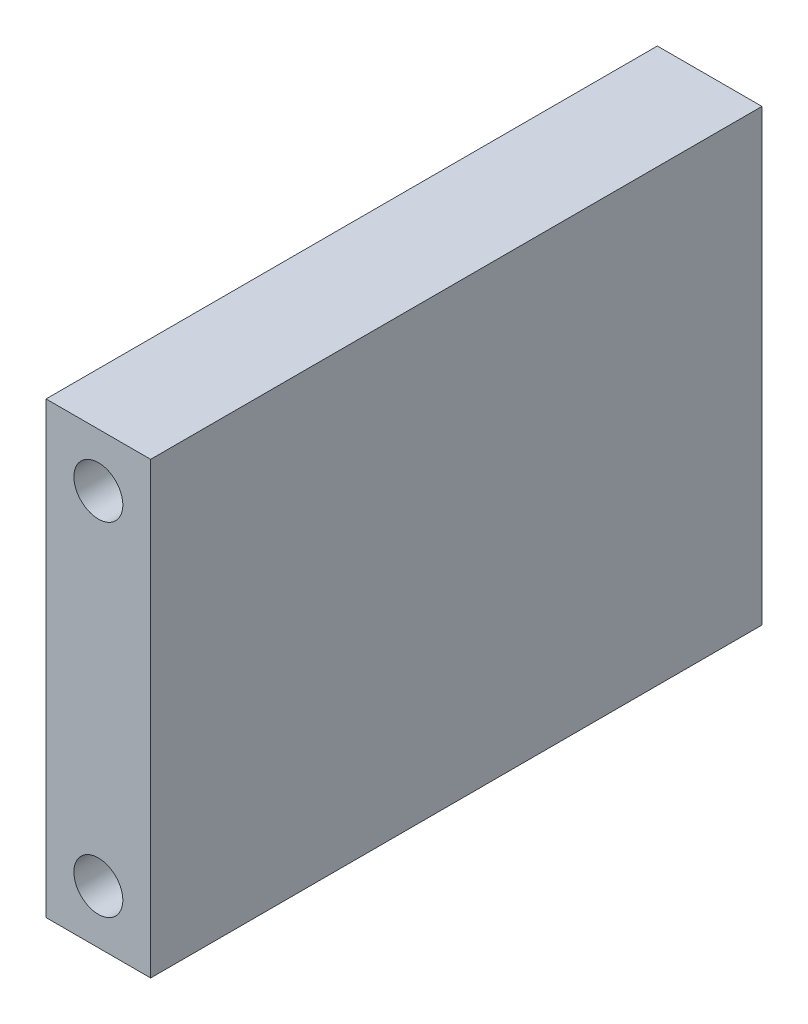
ISO-10303-21;
HEADER;
FILE_DESCRIPTION(('STEP AP214'),'2;1');
FILE_NAME('part.step','',(''),(''),'','','');
FILE_SCHEMA(('AUTOMOTIVE_DESIGN { 1 0 10303 214 1 1 1 1 }'));
ENDSEC;
DATA;
#1=APPLICATION_CONTEXT('core data for automotive mechanical design processes');
#2=APPLICATION_PROTOCOL_DEFINITION('international standard','automotive_design',2000,#1);
#3=PRODUCT_CONTEXT('',#1,'mechanical');
#4=PRODUCT('Part','Part','',(#3));
#5=PRODUCT_RELATED_PRODUCT_CATEGORY('part','',(#4));
#6=PRODUCT_DEFINITION_FORMATION('','',#4);
#7=PRODUCT_DEFINITION_CONTEXT('part definition',#1,'design');
#8=PRODUCT_DEFINITION('design','',#6,#7);
#9=PRODUCT_DEFINITION_SHAPE('','',#8);
#10=(LENGTH_UNIT() NAMED_UNIT(*) SI_UNIT(.MILLI.,.METRE.));
#11=(NAMED_UNIT(*) PLANE_ANGLE_UNIT() SI_UNIT($,.RADIAN.));
#12=(NAMED_UNIT(*) SI_UNIT($,.STERADIAN.) SOLID_ANGLE_UNIT());
#13=UNCERTAINTY_MEASURE_WITH_UNIT(LENGTH_MEASURE(1.E-05),#10,'distance_accuracy_value','');
#14=(GEOMETRIC_REPRESENTATION_CONTEXT(3) GLOBAL_UNCERTAINTY_ASSIGNED_CONTEXT((#13)) GLOBAL_UNIT_ASSIGNED_CONTEXT((#10,
#11,#12)) REPRESENTATION_CONTEXT('',''));
#15=CARTESIAN_POINT('',(0.,0.,0.));
#16=DIRECTION('',(0.,0.,1.));
#17=DIRECTION('',(1.,0.,0.));
#18=AXIS2_PLACEMENT_3D('',#15,#16,#17);
#19=CARTESIAN_POINT('',(0.,0.,100.));
#20=DIRECTION('',(0.,0.,1.));
#21=DIRECTION('',(1.,0.,0.));
#22=AXIS2_PLACEMENT_3D('',#19,#20,#21);
#23=PLANE('',#22);
#24=CARTESIAN_POINT('',(-0.335867215103036,-27.5104308390023,100.));
#25=DIRECTION('',(0.,0.,1.));
#26=DIRECTION('',(1.,0.,0.));
#27=AXIS2_PLACEMENT_3D('',#24,#25,#26);
#28=CIRCLE('',#27,4.);
#29=CARTESIAN_POINT('',(-4.33586721510304,-27.5104308390023,100.));
#30=VERTEX_POINT('',#29);
#31=EDGE_CURVE('E116',#30,#30,#28,.T.);
#32=ORIENTED_EDGE('',*,*,#31,.F.);
#33=EDGE_LOOP('',(#32));
#34=FACE_BOUND('',#33,.T.);
#35=DIRECTION('',(1.,0.,0.));
#36=VECTOR('',#35,1.);
#37=CARTESIAN_POINT('',(-8.89128955954653,-36.252349526689,100.));
#38=LINE('',#37,#36);
#39=CARTESIAN_POINT('',(-8.89128955954653,-36.252349526689,100.));
#40=VERTEX_POINT('',#39);
#41=CARTESIAN_POINT('',(8.21955512934046,-36.252349526689,100.));
#42=VERTEX_POINT('',#41);
#43=EDGE_CURVE('E96',#40,#42,#38,.T.);
#44=ORIENTED_EDGE('',*,*,#43,.T.);
#45=DIRECTION('',(0.,1.,0.));
#46=VECTOR('',#45,1.);
#47=CARTESIAN_POINT('',(8.21955512934046,-36.252349526689,100.));
#48=LINE('',#47,#46);
#49=CARTESIAN_POINT('',(8.21955512934046,37.2314878486845,100.));
#50=VERTEX_POINT('',#49);
#51=EDGE_CURVE('E91',#42,#50,#48,.T.);
#52=ORIENTED_EDGE('',*,*,#51,.T.);
#53=DIRECTION('',(-1.,0.,0.));
#54=VECTOR('',#53,1.);
#55=CARTESIAN_POINT('',(8.21955512934046,37.2314878486845,100.));
#56=LINE('',#55,#54);
#57=CARTESIAN_POINT('',(-8.89128955954653,37.2314878486845,100.));
#58=VERTEX_POINT('',#57);
#59=EDGE_CURVE('E94',#50,#58,#56,.T.);
#60=ORIENTED_EDGE('',*,*,#59,.T.);
#61=DIRECTION('',(0.,-1.,0.));
#62=VECTOR('',#61,1.);
#63=CARTESIAN_POINT('',(-8.89128955954653,37.2314878486845,100.));
#64=LINE('',#63,#62);
#65=EDGE_CURVE('E61',#58,#40,#64,.T.);
#66=ORIENTED_EDGE('',*,*,#65,.T.);
#67=EDGE_LOOP('',(#44,#52,#60,#66));
#68=FACE_BOUND('',#67,.T.);
#69=CARTESIAN_POINT('',(-0.335867215103036,28.4895691609977,100.));
#70=DIRECTION('',(0.,0.,1.));
#71=DIRECTION('',(1.,0.,0.));
#72=AXIS2_PLACEMENT_3D('',#69,#70,#71);
#73=CIRCLE('',#72,4.);
#74=CARTESIAN_POINT('',(-4.33586721510304,28.4895691609977,100.));
#75=VERTEX_POINT('',#74);
#76=EDGE_CURVE('E138',#75,#75,#73,.T.);
#77=ORIENTED_EDGE('',*,*,#76,.F.);
#78=EDGE_LOOP('',(#77));
#79=FACE_BOUND('',#78,.T.);
#80=ADVANCED_FACE('F43',(#34,#68,#79),#23,.T.);
#81=CARTESIAN_POINT('',(0.,0.,0.));
#82=DIRECTION('',(0.,0.,1.));
#83=DIRECTION('',(1.,0.,0.));
#84=AXIS2_PLACEMENT_3D('',#81,#82,#83);
#85=PLANE('',#84);
#86=DIRECTION('',(1.,0.,0.));
#87=VECTOR('',#86,1.);
#88=CARTESIAN_POINT('',(-8.89128955954653,-36.252349526689,0.));
#89=LINE('',#88,#87);
#90=CARTESIAN_POINT('',(-8.89128955954653,-36.252349526689,0.));
#91=VERTEX_POINT('',#90);
#92=CARTESIAN_POINT('',(8.21955512934046,-36.252349526689,0.));
#93=VERTEX_POINT('',#92);
#94=EDGE_CURVE('E112',#91,#93,#89,.T.);
#95=ORIENTED_EDGE('',*,*,#94,.F.);
#96=DIRECTION('',(0.,-1.,0.));
#97=VECTOR('',#96,1.);
#98=CARTESIAN_POINT('',(-8.89128955954653,37.2314878486845,0.));
#99=LINE('',#98,#97);
#100=CARTESIAN_POINT('',(-8.89128955954653,37.2314878486845,0.));
#101=VERTEX_POINT('',#100);
#102=EDGE_CURVE('E84',#101,#91,#99,.T.);
#103=ORIENTED_EDGE('',*,*,#102,.F.);
#104=DIRECTION('',(-1.,0.,0.));
#105=VECTOR('',#104,1.);
#106=CARTESIAN_POINT('',(8.21955512934046,37.2314878486845,0.));
#107=LINE('',#106,#105);
#108=CARTESIAN_POINT('',(8.21955512934046,37.2314878486845,0.));
#109=VERTEX_POINT('',#108);
#110=EDGE_CURVE('E78',#109,#101,#107,.T.);
#111=ORIENTED_EDGE('',*,*,#110,.F.);
#112=DIRECTION('',(0.,1.,0.));
#113=VECTOR('',#112,1.);
#114=CARTESIAN_POINT('',(8.21955512934046,-36.252349526689,0.));
#115=LINE('',#114,#113);
#116=EDGE_CURVE('E101',#93,#109,#115,.T.);
#117=ORIENTED_EDGE('',*,*,#116,.F.);
#118=EDGE_LOOP('',(#95,#103,#111,#117));
#119=FACE_BOUND('',#118,.T.);
#120=CARTESIAN_POINT('',(-0.335867215103036,-27.5104308390023,0.));
#121=DIRECTION('',(0.,0.,1.));
#122=DIRECTION('',(1.,0.,0.));
#123=AXIS2_PLACEMENT_3D('',#120,#121,#122);
#124=CIRCLE('',#123,4.);
#125=CARTESIAN_POINT('',(-4.33586721510304,-27.5104308390023,0.));
#126=VERTEX_POINT('',#125);
#127=EDGE_CURVE('E134',#126,#126,#124,.T.);
#128=ORIENTED_EDGE('',*,*,#127,.T.);
#129=EDGE_LOOP('',(#128));
#130=FACE_BOUND('',#129,.T.);
#131=CARTESIAN_POINT('',(-0.335867215103036,28.4895691609977,0.));
#132=DIRECTION('',(0.,0.,1.));
#133=DIRECTION('',(1.,0.,0.));
#134=AXIS2_PLACEMENT_3D('',#131,#132,#133);
#135=CIRCLE('',#134,4.);
#136=CARTESIAN_POINT('',(-4.33586721510304,28.4895691609977,0.));
#137=VERTEX_POINT('',#136);
#138=EDGE_CURVE('E142',#137,#137,#135,.T.);
#139=ORIENTED_EDGE('',*,*,#138,.T.);
#140=EDGE_LOOP('',(#139));
#141=FACE_BOUND('',#140,.T.);
#142=ADVANCED_FACE('F129',(#119,#130,#141),#85,.F.);
#143=CARTESIAN_POINT('',(-8.89128955954653,-36.252349526689,100.));
#144=DIRECTION('',(0.,1.,0.));
#145=DIRECTION('',(0.,0.,1.));
#146=AXIS2_PLACEMENT_3D('',#143,#144,#145);
#147=PLANE('',#146);
#148=ORIENTED_EDGE('',*,*,#94,.T.);
#149=DIRECTION('',(0.,0.,-1.));
#150=VECTOR('',#149,1.);
#151=CARTESIAN_POINT('',(8.21955512934046,-36.252349526689,100.));
#152=LINE('',#151,#150);
#153=EDGE_CURVE('E11',#42,#93,#152,.T.);
#154=ORIENTED_EDGE('',*,*,#153,.F.);
#155=ORIENTED_EDGE('',*,*,#43,.F.);
#156=DIRECTION('',(0.,0.,-1.));
#157=VECTOR('',#156,1.);
#158=CARTESIAN_POINT('',(-8.89128955954653,-36.252349526689,100.));
#159=LINE('',#158,#157);
#160=EDGE_CURVE('E108',#40,#91,#159,.T.);
#161=ORIENTED_EDGE('',*,*,#160,.T.);
#162=EDGE_LOOP('',(#148,#154,#155,#161));
#163=FACE_BOUND('',#162,.T.);
#164=ADVANCED_FACE('F45',(#163),#147,.F.);
#165=CARTESIAN_POINT('',(8.21955512934046,-36.252349526689,100.));
#166=DIRECTION('',(-1.,0.,0.));
#167=DIRECTION('',(0.,0.,1.));
#168=AXIS2_PLACEMENT_3D('',#165,#166,#167);
#169=PLANE('',#168);
#170=ORIENTED_EDGE('',*,*,#116,.T.);
#171=DIRECTION('',(0.,0.,-1.));
#172=VECTOR('',#171,1.);
#173=CARTESIAN_POINT('',(8.21955512934046,37.2314878486845,100.));
#174=LINE('',#173,#172);
#175=EDGE_CURVE('E53',#50,#109,#174,.T.);
#176=ORIENTED_EDGE('',*,*,#175,.F.);
#177=ORIENTED_EDGE('',*,*,#51,.F.);
#178=ORIENTED_EDGE('',*,*,#153,.T.);
#179=EDGE_LOOP('',(#170,#176,#177,#178));
#180=FACE_BOUND('',#179,.T.);
#181=ADVANCED_FACE('F100',(#180),#169,.F.);
#182=CARTESIAN_POINT('',(8.21955512934046,37.2314878486845,100.));
#183=DIRECTION('',(0.,-1.,0.));
#184=DIRECTION('',(0.,0.,-1.));
#185=AXIS2_PLACEMENT_3D('',#182,#183,#184);
#186=PLANE('',#185);
#187=ORIENTED_EDGE('',*,*,#110,.T.);
#188=DIRECTION('',(0.,0.,-1.));
#189=VECTOR('',#188,1.);
#190=CARTESIAN_POINT('',(-8.89128955954653,37.2314878486845,100.));
#191=LINE('',#190,#189);
#192=EDGE_CURVE('E103',#58,#101,#191,.T.);
#193=ORIENTED_EDGE('',*,*,#192,.F.);
#194=ORIENTED_EDGE('',*,*,#59,.F.);
#195=ORIENTED_EDGE('',*,*,#175,.T.);
#196=EDGE_LOOP('',(#187,#193,#194,#195));
#197=FACE_BOUND('',#196,.T.);
#198=ADVANCED_FACE('F104',(#197),#186,.F.);
#199=CARTESIAN_POINT('',(-8.89128955954653,37.2314878486845,100.));
#200=DIRECTION('',(1.,0.,0.));
#201=DIRECTION('',(0.,0.,-1.));
#202=AXIS2_PLACEMENT_3D('',#199,#200,#201);
#203=PLANE('',#202);
#204=ORIENTED_EDGE('',*,*,#102,.T.);
#205=ORIENTED_EDGE('',*,*,#160,.F.);
#206=ORIENTED_EDGE('',*,*,#65,.F.);
#207=ORIENTED_EDGE('',*,*,#192,.T.);
#208=EDGE_LOOP('',(#204,#205,#206,#207));
#209=FACE_BOUND('',#208,.T.);
#210=ADVANCED_FACE('F126',(#209),#203,.F.);
#211=CARTESIAN_POINT('',(-0.335867215103036,-27.5104308390023,100.));
#212=DIRECTION('',(0.,0.,-1.));
#213=DIRECTION('',(-1.,0.,0.));
#214=AXIS2_PLACEMENT_3D('',#211,#212,#213);
#215=CYLINDRICAL_SURFACE('',#214,4.);
#216=CARTESIAN_POINT('',(-4.33586721510304,-27.5104308390023,100.));
#217=CARTESIAN_POINT('',(-4.33586721510304,-27.5104308390023,98.9583333333333));
#218=CARTESIAN_POINT('',(-4.33586721510304,-27.5104308390023,97.9166666666667));
#219=CARTESIAN_POINT('',(-4.33586721510304,-27.5104308390023,95.8333333333333));
#220=CARTESIAN_POINT('',(-4.33586721510304,-27.5104308390023,94.7916666666666));
#221=CARTESIAN_POINT('',(-4.33586721510304,-27.5104308390023,92.7083333333333));
#222=CARTESIAN_POINT('',(-4.33586721510304,-27.5104308390023,91.6666666666666));
#223=CARTESIAN_POINT('',(-4.33586721510304,-27.5104308390023,89.5833333333333));
#224=CARTESIAN_POINT('',(-4.33586721510304,-27.5104308390023,88.5416666666666));
#225=CARTESIAN_POINT('',(-4.33586721510304,-27.5104308390023,86.4583333333333));
#226=CARTESIAN_POINT('',(-4.33586721510304,-27.5104308390023,85.4166666666667));
#227=CARTESIAN_POINT('',(-4.33586721510304,-27.5104308390023,83.3333333333333));
#228=CARTESIAN_POINT('',(-4.33586721510304,-27.5104308390023,82.2916666666667));
#229=CARTESIAN_POINT('',(-4.33586721510304,-27.5104308390023,80.2083333333333));
#230=CARTESIAN_POINT('',(-4.33586721510304,-27.5104308390023,79.1666666666666));
#231=CARTESIAN_POINT('',(-4.33586721510304,-27.5104308390023,77.0833333333333));
#232=CARTESIAN_POINT('',(-4.33586721510304,-27.5104308390023,76.0416666666666));
#233=CARTESIAN_POINT('',(-4.33586721510304,-27.5104308390023,73.9583333333333));
#234=CARTESIAN_POINT('',(-4.33586721510304,-27.5104308390023,72.9166666666667));
#235=CARTESIAN_POINT('',(-4.33586721510304,-27.5104308390023,70.8333333333333));
#236=CARTESIAN_POINT('',(-4.33586721510304,-27.5104308390023,69.7916666666667));
#237=CARTESIAN_POINT('',(-4.33586721510304,-27.5104308390023,67.7083333333333));
#238=CARTESIAN_POINT('',(-4.33586721510304,-27.5104308390023,66.6666666666667));
#239=CARTESIAN_POINT('',(-4.33586721510304,-27.5104308390023,64.5833333333333));
#240=CARTESIAN_POINT('',(-4.33586721510304,-27.5104308390023,63.5416666666667));
#241=CARTESIAN_POINT('',(-4.33586721510304,-27.5104308390023,61.4583333333333));
#242=CARTESIAN_POINT('',(-4.33586721510304,-27.5104308390023,60.4166666666667));
#243=CARTESIAN_POINT('',(-4.33586721510304,-27.5104308390023,58.3333333333333));
#244=CARTESIAN_POINT('',(-4.33586721510304,-27.5104308390023,57.2916666666667));
#245=CARTESIAN_POINT('',(-4.33586721510304,-27.5104308390023,55.2083333333333));
#246=CARTESIAN_POINT('',(-4.33586721510304,-27.5104308390023,54.1666666666667));
#247=CARTESIAN_POINT('',(-4.33586721510304,-27.5104308390023,52.0833333333333));
#248=CARTESIAN_POINT('',(-4.33586721510304,-27.5104308390023,51.0416666666667));
#249=CARTESIAN_POINT('',(-4.33586721510304,-27.5104308390023,48.9583333333333));
#250=CARTESIAN_POINT('',(-4.33586721510304,-27.5104308390023,47.9166666666667));
#251=CARTESIAN_POINT('',(-4.33586721510304,-27.5104308390023,45.8333333333333));
#252=CARTESIAN_POINT('',(-4.33586721510304,-27.5104308390023,44.7916666666667));
#253=CARTESIAN_POINT('',(-4.33586721510304,-27.5104308390023,42.7083333333333));
#254=CARTESIAN_POINT('',(-4.33586721510304,-27.5104308390023,41.6666666666667));
#255=CARTESIAN_POINT('',(-4.33586721510304,-27.5104308390023,39.5833333333333));
#256=CARTESIAN_POINT('',(-4.33586721510304,-27.5104308390023,38.5416666666667));
#257=CARTESIAN_POINT('',(-4.33586721510304,-27.5104308390023,36.4583333333333));
#258=CARTESIAN_POINT('',(-4.33586721510304,-27.5104308390023,35.4166666666667));
#259=CARTESIAN_POINT('',(-4.33586721510304,-27.5104308390023,33.3333333333333));
#260=CARTESIAN_POINT('',(-4.33586721510304,-27.5104308390023,32.2916666666667));
#261=CARTESIAN_POINT('',(-4.33586721510304,-27.5104308390023,30.2083333333333));
#262=CARTESIAN_POINT('',(-4.33586721510304,-27.5104308390023,29.1666666666667));
#263=CARTESIAN_POINT('',(-4.33586721510304,-27.5104308390023,27.0833333333333));
#264=CARTESIAN_POINT('',(-4.33586721510304,-27.5104308390023,26.0416666666667));
#265=CARTESIAN_POINT('',(-4.33586721510304,-27.5104308390023,23.9583333333333));
#266=CARTESIAN_POINT('',(-4.33586721510304,-27.5104308390023,22.9166666666667));
#267=CARTESIAN_POINT('',(-4.33586721510304,-27.5104308390023,20.8333333333333));
#268=CARTESIAN_POINT('',(-4.33586721510304,-27.5104308390023,19.7916666666667));
#269=CARTESIAN_POINT('',(-4.33586721510304,-27.5104308390023,17.7083333333333));
#270=CARTESIAN_POINT('',(-4.33586721510304,-27.5104308390023,16.6666666666667));
#271=CARTESIAN_POINT('',(-4.33586721510304,-27.5104308390023,14.5833333333333));
#272=CARTESIAN_POINT('',(-4.33586721510304,-27.5104308390023,13.5416666666667));
#273=CARTESIAN_POINT('',(-4.33586721510304,-27.5104308390023,11.4583333333333));
#274=CARTESIAN_POINT('',(-4.33586721510304,-27.5104308390023,10.4166666666667));
#275=CARTESIAN_POINT('',(-4.33586721510304,-27.5104308390023,8.33333333333333));
#276=CARTESIAN_POINT('',(-4.33586721510304,-27.5104308390023,7.29166666666667));
#277=CARTESIAN_POINT('',(-4.33586721510304,-27.5104308390023,5.20833333333334));
#278=CARTESIAN_POINT('',(-4.33586721510304,-27.5104308390023,4.16666666666667));
#279=CARTESIAN_POINT('',(-4.33586721510304,-27.5104308390023,2.08333333333334));
#280=CARTESIAN_POINT('',(-4.33586721510304,-27.5104308390023,1.04166666666667));
#281=CARTESIAN_POINT('',(-4.33586721510304,-27.5104308390023,0.));
#282=B_SPLINE_CURVE_WITH_KNOTS('',3,(#216,#217,#218,#219,#220,#221,#222,#223,#224,#225,#226,
#227,#228,#229,#230,#231,#232,#233,#234,#235,#236,#237,#238,#239,#240,#241,#242,#243,#244,#245,
#246,#247,#248,#249,#250,#251,#252,#253,#254,#255,#256,#257,#258,#259,#260,#261,#262,#263,#264,
#265,#266,#267,#268,#269,#270,#271,#272,#273,#274,#275,#276,#277,#278,#279,#280,#281),
.UNSPECIFIED.,.F.,.F.,(4,2,2,2,2,2,2,2,2,2,2,2,2,2,2,2,2,2,2,2,2,2,2,2,2,2,2,2,2,2,2,2,4),(0.,
3.125,6.25000000000001,9.37500000000001,12.5,15.625,18.75,21.875,25.,28.125,31.25,34.375,37.5,
40.625,43.75,46.875,50.,53.125,56.25,59.375,62.5,65.625,68.75,71.875,75.,78.125,81.25,84.375,
87.5,90.625,93.75,96.875,100.),.UNSPECIFIED.);
#283=EDGE_CURVE('BSEAM161',#30,#126,#282,.T.);
#284=ORIENTED_EDGE('',*,*,#31,.T.);
#285=ORIENTED_EDGE('',*,*,#127,.F.);
#286=ORIENTED_EDGE('',*,*,#283,.T.);
#287=ORIENTED_EDGE('',*,*,#283,.F.);
#288=EDGE_LOOP('',(#284,#286,#285,#287));
#289=FACE_BOUND('',#288,.T.);
#290=ADVANCED_FACE('F161',(#289),#215,.F.);
#291=CARTESIAN_POINT('',(-0.335867215103036,28.4895691609977,100.));
#292=DIRECTION('',(0.,0.,-1.));
#293=DIRECTION('',(-1.,0.,0.));
#294=AXIS2_PLACEMENT_3D('',#291,#292,#293);
#295=CYLINDRICAL_SURFACE('',#294,4.);
#296=CARTESIAN_POINT('',(-4.33586721510304,28.4895691609977,100.));
#297=CARTESIAN_POINT('',(-4.33586721510304,28.4895691609977,98.9583333333333));
#298=CARTESIAN_POINT('',(-4.33586721510304,28.4895691609977,97.9166666666667));
#299=CARTESIAN_POINT('',(-4.33586721510304,28.4895691609977,95.8333333333333));
#300=CARTESIAN_POINT('',(-4.33586721510304,28.4895691609977,94.7916666666666));
#301=CARTESIAN_POINT('',(-4.33586721510304,28.4895691609977,92.7083333333333));
#302=CARTESIAN_POINT('',(-4.33586721510304,28.4895691609977,91.6666666666666));
#303=CARTESIAN_POINT('',(-4.33586721510304,28.4895691609977,89.5833333333333));
#304=CARTESIAN_POINT('',(-4.33586721510304,28.4895691609977,88.5416666666666));
#305=CARTESIAN_POINT('',(-4.33586721510304,28.4895691609977,86.4583333333333));
#306=CARTESIAN_POINT('',(-4.33586721510304,28.4895691609977,85.4166666666667));
#307=CARTESIAN_POINT('',(-4.33586721510304,28.4895691609977,83.3333333333333));
#308=CARTESIAN_POINT('',(-4.33586721510304,28.4895691609977,82.2916666666667));
#309=CARTESIAN_POINT('',(-4.33586721510304,28.4895691609977,80.2083333333333));
#310=CARTESIAN_POINT('',(-4.33586721510304,28.4895691609977,79.1666666666666));
#311=CARTESIAN_POINT('',(-4.33586721510304,28.4895691609977,77.0833333333333));
#312=CARTESIAN_POINT('',(-4.33586721510304,28.4895691609977,76.0416666666666));
#313=CARTESIAN_POINT('',(-4.33586721510304,28.4895691609977,73.9583333333333));
#314=CARTESIAN_POINT('',(-4.33586721510304,28.4895691609977,72.9166666666667));
#315=CARTESIAN_POINT('',(-4.33586721510304,28.4895691609977,70.8333333333333));
#316=CARTESIAN_POINT('',(-4.33586721510304,28.4895691609977,69.7916666666667));
#317=CARTESIAN_POINT('',(-4.33586721510304,28.4895691609977,67.7083333333333));
#318=CARTESIAN_POINT('',(-4.33586721510304,28.4895691609977,66.6666666666667));
#319=CARTESIAN_POINT('',(-4.33586721510304,28.4895691609977,64.5833333333333));
#320=CARTESIAN_POINT('',(-4.33586721510304,28.4895691609977,63.5416666666667));
#321=CARTESIAN_POINT('',(-4.33586721510304,28.4895691609977,61.4583333333333));
#322=CARTESIAN_POINT('',(-4.33586721510304,28.4895691609977,60.4166666666667));
#323=CARTESIAN_POINT('',(-4.33586721510304,28.4895691609977,58.3333333333333));
#324=CARTESIAN_POINT('',(-4.33586721510304,28.4895691609977,57.2916666666667));
#325=CARTESIAN_POINT('',(-4.33586721510304,28.4895691609977,55.2083333333333));
#326=CARTESIAN_POINT('',(-4.33586721510304,28.4895691609977,54.1666666666667));
#327=CARTESIAN_POINT('',(-4.33586721510304,28.4895691609977,52.0833333333333));
#328=CARTESIAN_POINT('',(-4.33586721510304,28.4895691609977,51.0416666666667));
#329=CARTESIAN_POINT('',(-4.33586721510304,28.4895691609977,48.9583333333333));
#330=CARTESIAN_POINT('',(-4.33586721510304,28.4895691609977,47.9166666666667));
#331=CARTESIAN_POINT('',(-4.33586721510304,28.4895691609977,45.8333333333333));
#332=CARTESIAN_POINT('',(-4.33586721510304,28.4895691609977,44.7916666666667));
#333=CARTESIAN_POINT('',(-4.33586721510304,28.4895691609977,42.7083333333333));
#334=CARTESIAN_POINT('',(-4.33586721510304,28.4895691609977,41.6666666666667));
#335=CARTESIAN_POINT('',(-4.33586721510304,28.4895691609977,39.5833333333333));
#336=CARTESIAN_POINT('',(-4.33586721510304,28.4895691609977,38.5416666666667));
#337=CARTESIAN_POINT('',(-4.33586721510304,28.4895691609977,36.4583333333333));
#338=CARTESIAN_POINT('',(-4.33586721510304,28.4895691609977,35.4166666666667));
#339=CARTESIAN_POINT('',(-4.33586721510304,28.4895691609977,33.3333333333333));
#340=CARTESIAN_POINT('',(-4.33586721510304,28.4895691609977,32.2916666666667));
#341=CARTESIAN_POINT('',(-4.33586721510304,28.4895691609977,30.2083333333333));
#342=CARTESIAN_POINT('',(-4.33586721510304,28.4895691609977,29.1666666666667));
#343=CARTESIAN_POINT('',(-4.33586721510304,28.4895691609977,27.0833333333333));
#344=CARTESIAN_POINT('',(-4.33586721510304,28.4895691609977,26.0416666666667));
#345=CARTESIAN_POINT('',(-4.33586721510304,28.4895691609977,23.9583333333333));
#346=CARTESIAN_POINT('',(-4.33586721510304,28.4895691609977,22.9166666666667));
#347=CARTESIAN_POINT('',(-4.33586721510304,28.4895691609977,20.8333333333333));
#348=CARTESIAN_POINT('',(-4.33586721510304,28.4895691609977,19.7916666666667));
#349=CARTESIAN_POINT('',(-4.33586721510304,28.4895691609977,17.7083333333333));
#350=CARTESIAN_POINT('',(-4.33586721510304,28.4895691609977,16.6666666666667));
#351=CARTESIAN_POINT('',(-4.33586721510304,28.4895691609977,14.5833333333333));
#352=CARTESIAN_POINT('',(-4.33586721510304,28.4895691609977,13.5416666666667));
#353=CARTESIAN_POINT('',(-4.33586721510304,28.4895691609977,11.4583333333333));
#354=CARTESIAN_POINT('',(-4.33586721510304,28.4895691609977,10.4166666666667));
#355=CARTESIAN_POINT('',(-4.33586721510304,28.4895691609977,8.33333333333333));
#356=CARTESIAN_POINT('',(-4.33586721510304,28.4895691609977,7.29166666666667));
#357=CARTESIAN_POINT('',(-4.33586721510304,28.4895691609977,5.20833333333334));
#358=CARTESIAN_POINT('',(-4.33586721510304,28.4895691609977,4.16666666666667));
#359=CARTESIAN_POINT('',(-4.33586721510304,28.4895691609977,2.08333333333334));
#360=CARTESIAN_POINT('',(-4.33586721510304,28.4895691609977,1.04166666666667));
#361=CARTESIAN_POINT('',(-4.33586721510304,28.4895691609977,0.));
#362=B_SPLINE_CURVE_WITH_KNOTS('',3,(#296,#297,#298,#299,#300,#301,#302,#303,#304,#305,#306,
#307,#308,#309,#310,#311,#312,#313,#314,#315,#316,#317,#318,#319,#320,#321,#322,#323,#324,#325,
#326,#327,#328,#329,#330,#331,#332,#333,#334,#335,#336,#337,#338,#339,#340,#341,#342,#343,#344,
#345,#346,#347,#348,#349,#350,#351,#352,#353,#354,#355,#356,#357,#358,#359,#360,#361),
.UNSPECIFIED.,.F.,.F.,(4,2,2,2,2,2,2,2,2,2,2,2,2,2,2,2,2,2,2,2,2,2,2,2,2,2,2,2,2,2,2,2,4),(0.,
3.125,6.25000000000001,9.37500000000001,12.5,15.625,18.75,21.875,25.,28.125,31.25,34.375,37.5,
40.625,43.75,46.875,50.,53.125,56.25,59.375,62.5,65.625,68.75,71.875,75.,78.125,81.25,84.375,
87.5,90.625,93.75,96.875,100.),.UNSPECIFIED.);
#363=EDGE_CURVE('BSEAM150',#75,#137,#362,.T.);
#364=ORIENTED_EDGE('',*,*,#76,.T.);
#365=ORIENTED_EDGE('',*,*,#138,.F.);
#366=ORIENTED_EDGE('',*,*,#363,.T.);
#367=ORIENTED_EDGE('',*,*,#363,.F.);
#368=EDGE_LOOP('',(#364,#366,#365,#367));
#369=FACE_BOUND('',#368,.T.);
#370=ADVANCED_FACE('F150',(#369),#295,.F.);
#371=CLOSED_SHELL('',(#80,#142,#164,#181,#198,#210,#290,#370));
#372=MANIFOLD_SOLID_BREP('B2',#371);
#373=ADVANCED_BREP_SHAPE_REPRESENTATION('',(#18,#372),#14);
#374=SHAPE_DEFINITION_REPRESENTATION(#9,#373);
ENDSEC;
END-ISO-10303-21;
